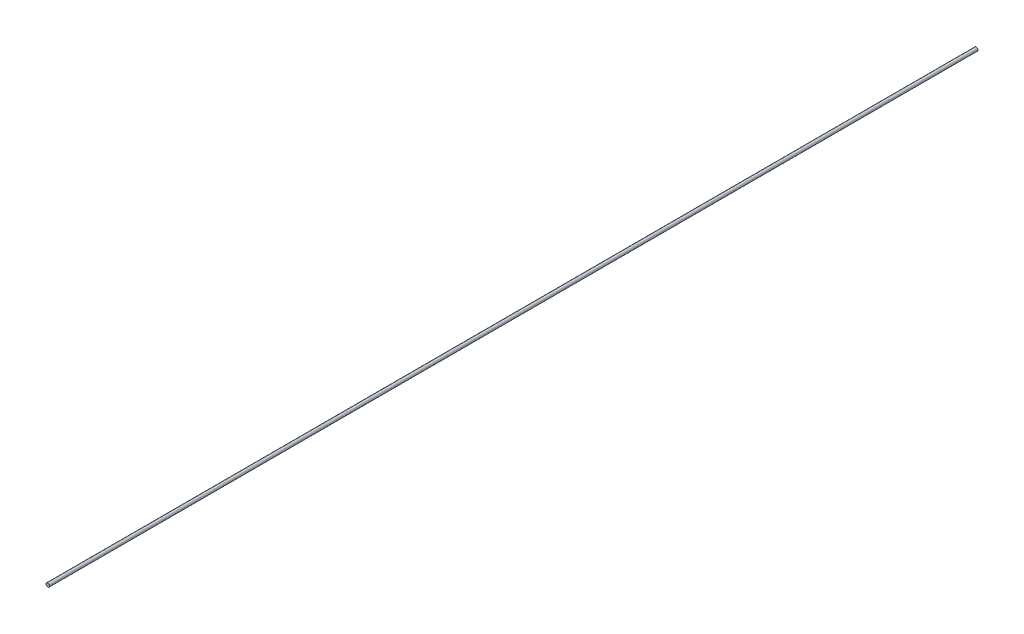
ISO-10303-21;
HEADER;
FILE_DESCRIPTION(('STEP AP214'),'2;1');
FILE_NAME('part.step','',(''),(''),'','','');
FILE_SCHEMA(('AUTOMOTIVE_DESIGN { 1 0 10303 214 1 1 1 1 }'));
ENDSEC;
DATA;
#1=APPLICATION_CONTEXT('core data for automotive mechanical design processes');
#2=APPLICATION_PROTOCOL_DEFINITION('international standard','automotive_design',2000,#1);
#3=PRODUCT_CONTEXT('',#1,'mechanical');
#4=PRODUCT('Part','Part','',(#3));
#5=PRODUCT_RELATED_PRODUCT_CATEGORY('part','',(#4));
#6=PRODUCT_DEFINITION_FORMATION('','',#4);
#7=PRODUCT_DEFINITION_CONTEXT('part definition',#1,'design');
#8=PRODUCT_DEFINITION('design','',#6,#7);
#9=PRODUCT_DEFINITION_SHAPE('','',#8);
#10=(LENGTH_UNIT() NAMED_UNIT(*) SI_UNIT(.MILLI.,.METRE.));
#11=(NAMED_UNIT(*) PLANE_ANGLE_UNIT() SI_UNIT($,.RADIAN.));
#12=(NAMED_UNIT(*) SI_UNIT($,.STERADIAN.) SOLID_ANGLE_UNIT());
#13=UNCERTAINTY_MEASURE_WITH_UNIT(LENGTH_MEASURE(1.E-05),#10,'distance_accuracy_value','');
#14=(GEOMETRIC_REPRESENTATION_CONTEXT(3) GLOBAL_UNCERTAINTY_ASSIGNED_CONTEXT((#13)) GLOBAL_UNIT_ASSIGNED_CONTEXT((#10,
#11,#12)) REPRESENTATION_CONTEXT('',''));
#15=CARTESIAN_POINT('',(0.,0.,0.));
#16=DIRECTION('',(0.,0.,1.));
#17=DIRECTION('',(1.,0.,0.));
#18=AXIS2_PLACEMENT_3D('',#15,#16,#17);
#19=CARTESIAN_POINT('',(0.,0.,1250.));
#20=DIRECTION('',(0.,0.,-1.));
#21=DIRECTION('',(-1.,0.,0.));
#22=AXIS2_PLACEMENT_3D('',#19,#20,#21);
#23=CYLINDRICAL_SURFACE('',#22,4.75);
#24=CARTESIAN_POINT('',(0.,0.,1250.));
#25=DIRECTION('',(0.,0.,1.));
#26=DIRECTION('',(1.,0.,0.));
#27=AXIS2_PLACEMENT_3D('',#24,#25,#26);
#28=CIRCLE('',#27,4.75);
#29=CARTESIAN_POINT('',(4.75,0.,1250.));
#30=VERTEX_POINT('',#29);
#31=EDGE_CURVE('E10',#30,#30,#28,.T.);
#32=ORIENTED_EDGE('',*,*,#31,.F.);
#33=EDGE_LOOP('',(#32));
#34=FACE_BOUND('',#33,.T.);
#35=CARTESIAN_POINT('',(0.,0.,-1250.));
#36=DIRECTION('',(0.,0.,1.));
#37=DIRECTION('',(1.,0.,0.));
#38=AXIS2_PLACEMENT_3D('',#35,#36,#37);
#39=CIRCLE('',#38,4.75);
#40=CARTESIAN_POINT('',(4.75,0.,-1250.));
#41=VERTEX_POINT('',#40);
#42=EDGE_CURVE('E43',#41,#41,#39,.T.);
#43=ORIENTED_EDGE('',*,*,#42,.T.);
#44=EDGE_LOOP('',(#43));
#45=FACE_BOUND('',#44,.T.);
#46=ADVANCED_FACE('F40',(#34,#45),#23,.T.);
#47=CARTESIAN_POINT('',(0.,0.,1250.));
#48=DIRECTION('',(0.,0.,1.));
#49=DIRECTION('',(1.,0.,0.));
#50=AXIS2_PLACEMENT_3D('',#47,#48,#49);
#51=PLANE('',#50);
#52=ORIENTED_EDGE('',*,*,#31,.T.);
#53=EDGE_LOOP('',(#52));
#54=FACE_BOUND('',#53,.T.);
#55=ADVANCED_FACE('F57',(#54),#51,.T.);
#56=CARTESIAN_POINT('',(0.,0.,-1250.));
#57=DIRECTION('',(0.,0.,1.));
#58=DIRECTION('',(1.,0.,0.));
#59=AXIS2_PLACEMENT_3D('',#56,#57,#58);
#60=PLANE('',#59);
#61=ORIENTED_EDGE('',*,*,#42,.F.);
#62=EDGE_LOOP('',(#61));
#63=FACE_BOUND('',#62,.T.);
#64=ADVANCED_FACE('F55',(#63),#60,.F.);
#65=CLOSED_SHELL('',(#46,#55,#64));
#66=MANIFOLD_SOLID_BREP('B2',#65);
#67=ADVANCED_BREP_SHAPE_REPRESENTATION('',(#18,#66),#14);
#68=SHAPE_DEFINITION_REPRESENTATION(#9,#67);
ENDSEC;
END-ISO-10303-21;
